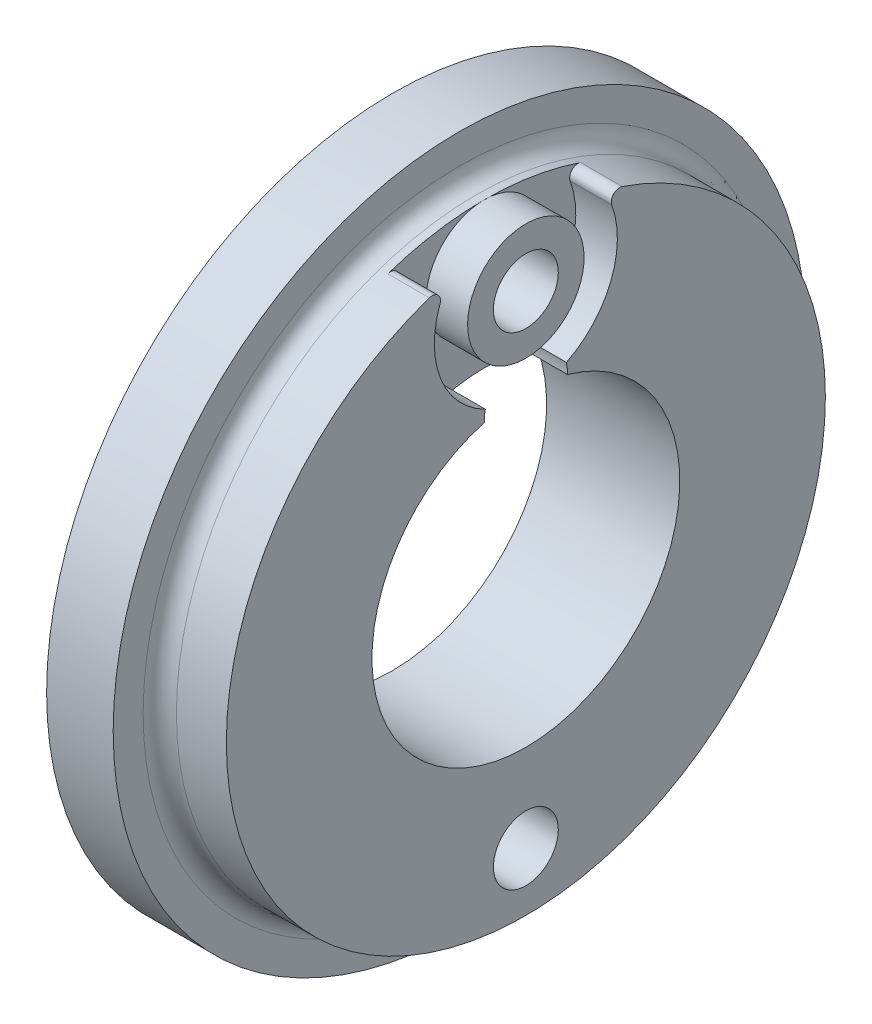
ISO-10303-21;
HEADER;
FILE_DESCRIPTION(('STEP AP214'),'2;1');
FILE_NAME('part.step','',(''),(''),'','','');
FILE_SCHEMA(('AUTOMOTIVE_DESIGN { 1 0 10303 214 1 1 1 1 }'));
ENDSEC;
DATA;
#1=APPLICATION_CONTEXT('core data for automotive mechanical design processes');
#2=APPLICATION_PROTOCOL_DEFINITION('international standard','automotive_design',2000,#1);
#3=PRODUCT_CONTEXT('',#1,'mechanical');
#4=PRODUCT('Part','Part','',(#3));
#5=PRODUCT_RELATED_PRODUCT_CATEGORY('part','',(#4));
#6=PRODUCT_DEFINITION_FORMATION('','',#4);
#7=PRODUCT_DEFINITION_CONTEXT('part definition',#1,'design');
#8=PRODUCT_DEFINITION('design','',#6,#7);
#9=PRODUCT_DEFINITION_SHAPE('','',#8);
#10=(LENGTH_UNIT() NAMED_UNIT(*) SI_UNIT(.MILLI.,.METRE.));
#11=(NAMED_UNIT(*) PLANE_ANGLE_UNIT() SI_UNIT($,.RADIAN.));
#12=(NAMED_UNIT(*) SI_UNIT($,.STERADIAN.) SOLID_ANGLE_UNIT());
#13=UNCERTAINTY_MEASURE_WITH_UNIT(LENGTH_MEASURE(1.E-05),#10,'distance_accuracy_value','');
#14=(GEOMETRIC_REPRESENTATION_CONTEXT(3) GLOBAL_UNCERTAINTY_ASSIGNED_CONTEXT((#13)) GLOBAL_UNIT_ASSIGNED_CONTEXT((#10,
#11,#12)) REPRESENTATION_CONTEXT('',''));
#15=CARTESIAN_POINT('',(0.,0.,0.));
#16=DIRECTION('',(0.,0.,1.));
#17=DIRECTION('',(1.,0.,0.));
#18=AXIS2_PLACEMENT_3D('',#15,#16,#17);
#19=CARTESIAN_POINT('',(26.2081253452331,7.96961524227068,35.));
#20=DIRECTION('',(-1.,0.,0.));
#21=DIRECTION('',(0.,1.,0.));
#22=AXIS2_PLACEMENT_3D('',#19,#20,#21);
#23=PLANE('',#22);
#24=CARTESIAN_POINT('',(26.2081253452331,15.2196152422707,35.));
#25=DIRECTION('',(1.,0.,0.));
#26=DIRECTION('',(0.,-1.,0.));
#27=AXIS2_PLACEMENT_3D('',#24,#25,#26);
#28=CIRCLE('',#27,0.975);
#29=CARTESIAN_POINT('',(26.2081253452331,16.1946152422707,35.));
#30=VERTEX_POINT('',#29);
#31=EDGE_CURVE('E327',#30,#30,#28,.T.);
#32=ORIENTED_EDGE('',*,*,#31,.F.);
#33=EDGE_LOOP('',(#32));
#34=FACE_BOUND('',#33,.T.);
#35=CARTESIAN_POINT('',(26.2081253452331,15.2196152422707,35.));
#36=DIRECTION('',(1.,0.,0.));
#37=DIRECTION('',(0.,1.,0.));
#38=AXIS2_PLACEMENT_3D('',#35,#36,#37);
#39=CIRCLE('',#38,1.75);
#40=CARTESIAN_POINT('',(26.2081253452331,13.4696152422707,35.));
#41=VERTEX_POINT('',#40);
#42=EDGE_CURVE('E308',#41,#41,#39,.T.);
#43=ORIENTED_EDGE('',*,*,#42,.T.);
#44=EDGE_LOOP('',(#43));
#45=FACE_BOUND('',#44,.T.);
#46=ADVANCED_FACE('F51',(#34,#45),#23,.F.);
#47=CARTESIAN_POINT('',(22.2081253452331,7.96961524227068,35.));
#48=DIRECTION('',(-1.,0.,0.));
#49=DIRECTION('',(0.,1.,0.));
#50=AXIS2_PLACEMENT_3D('',#47,#48,#49);
#51=PLANE('',#50);
#52=CARTESIAN_POINT('',(22.2081253452331,0.719615242270678,35.));
#53=DIRECTION('',(1.,0.,0.));
#54=DIRECTION('',(0.,-1.,0.));
#55=AXIS2_PLACEMENT_3D('',#52,#53,#54);
#56=CIRCLE('',#55,0.975);
#57=CARTESIAN_POINT('',(22.2081253452331,1.69461524227068,35.));
#58=VERTEX_POINT('',#57);
#59=EDGE_CURVE('E339',#58,#58,#56,.T.);
#60=ORIENTED_EDGE('',*,*,#59,.T.);
#61=EDGE_LOOP('',(#60));
#62=FACE_BOUND('',#61,.T.);
#63=CARTESIAN_POINT('',(22.2081253452331,15.2196152422707,35.));
#64=DIRECTION('',(1.,0.,0.));
#65=DIRECTION('',(0.,-1.,0.));
#66=AXIS2_PLACEMENT_3D('',#63,#64,#65);
#67=CIRCLE('',#66,0.975);
#68=CARTESIAN_POINT('',(22.2081253452331,16.1946152422707,35.));
#69=VERTEX_POINT('',#68);
#70=EDGE_CURVE('E332',#69,#69,#67,.T.);
#71=ORIENTED_EDGE('',*,*,#70,.T.);
#72=EDGE_LOOP('',(#71));
#73=FACE_BOUND('',#72,.T.);
#74=CARTESIAN_POINT('',(22.2081253452331,7.96961524227068,35.));
#75=DIRECTION('',(1.,0.,0.));
#76=DIRECTION('',(0.,-1.,0.));
#77=AXIS2_PLACEMENT_3D('',#74,#75,#76);
#78=CIRCLE('',#77,4.625);
#79=CARTESIAN_POINT('',(22.2081253452331,12.5946152422707,35.));
#80=VERTEX_POINT('',#79);
#81=EDGE_CURVE('E322',#80,#80,#78,.T.);
#82=ORIENTED_EDGE('',*,*,#81,.T.);
#83=EDGE_LOOP('',(#82));
#84=FACE_BOUND('',#83,.T.);
#85=CARTESIAN_POINT('',(22.2081253452331,7.96961524227068,35.));
#86=DIRECTION('',(-1.,0.,0.));
#87=DIRECTION('',(0.,-1.,0.));
#88=AXIS2_PLACEMENT_3D('',#85,#86,#87);
#89=CIRCLE('',#88,10.4);
#90=CARTESIAN_POINT('',(22.2081253452331,18.3696152422707,35.));
#91=VERTEX_POINT('',#90);
#92=EDGE_CURVE('E53',#91,#91,#89,.T.);
#93=ORIENTED_EDGE('',*,*,#92,.T.);
#94=EDGE_LOOP('',(#93));
#95=FACE_BOUND('',#94,.T.);
#96=ADVANCED_FACE('F362',(#62,#73,#84,#95),#51,.T.);
#97=CARTESIAN_POINT('',(26.2081253452331,7.96961524227068,35.));
#98=DIRECTION('',(-1.,0.,0.));
#99=DIRECTION('',(0.,-1.,0.));
#100=AXIS2_PLACEMENT_3D('',#97,#98,#99);
#101=CYLINDRICAL_SURFACE('',#100,10.4);
#102=ORIENTED_EDGE('',*,*,#92,.F.);
#103=DIRECTION('',(1.,0.,0.));
#104=VECTOR('',#103,1.);
#105=CARTESIAN_POINT('',(26.2081253452331,18.3696152422707,35.));
#106=LINE('',#105,#104);
#107=CARTESIAN_POINT('',(24.2081253452331,18.3696152422707,35.));
#108=VERTEX_POINT('',#107);
#109=EDGE_CURVE('E11',#91,#108,#106,.T.);
#110=ORIENTED_EDGE('',*,*,#109,.T.);
#111=CARTESIAN_POINT('',(24.2081253452331,7.96961524227068,35.));
#112=DIRECTION('',(-1.,0.,0.));
#113=DIRECTION('',(0.,-1.,0.));
#114=AXIS2_PLACEMENT_3D('',#111,#112,#113);
#115=CIRCLE('',#114,10.4);
#116=EDGE_CURVE('E261',#108,#108,#115,.T.);
#117=ORIENTED_EDGE('',*,*,#116,.T.);
#118=ORIENTED_EDGE('',*,*,#109,.F.);
#119=EDGE_LOOP('',(#102,#110,#117,#118));
#120=FACE_BOUND('',#119,.T.);
#121=ADVANCED_FACE('F364',(#120),#101,.T.);
#122=CARTESIAN_POINT('',(26.2081253452331,7.96961524227068,35.));
#123=DIRECTION('',(-1.,0.,0.));
#124=DIRECTION('',(0.,-1.,0.));
#125=AXIS2_PLACEMENT_3D('',#122,#123,#124);
#126=CYLINDRICAL_SURFACE('',#125,4.625);
#127=ORIENTED_EDGE('',*,*,#81,.F.);
#128=DIRECTION('',(1.,0.,0.));
#129=VECTOR('',#128,1.);
#130=CARTESIAN_POINT('',(26.2081253452331,12.5946152422707,35.));
#131=LINE('',#130,#129);
#132=CARTESIAN_POINT('',(24.9581253452331,12.5946152422707,35.));
#133=VERTEX_POINT('',#132);
#134=EDGE_CURVE('E80',#80,#133,#131,.T.);
#135=ORIENTED_EDGE('',*,*,#134,.T.);
#136=CARTESIAN_POINT('',(24.9581253452331,7.96961524227068,35.));
#137=DIRECTION('',(1.,0.,0.));
#138=DIRECTION('',(0.,-1.,0.));
#139=AXIS2_PLACEMENT_3D('',#136,#137,#138);
#140=CIRCLE('',#139,4.625);
#141=CARTESIAN_POINT('',(24.9581253452331,12.4227402422707,36.2491207845421));
#142=VERTEX_POINT('',#141);
#143=EDGE_CURVE('E219',#133,#142,#140,.T.);
#144=ORIENTED_EDGE('',*,*,#143,.T.);
#145=DIRECTION('',(1.,0.,0.));
#146=VECTOR('',#145,1.);
#147=CARTESIAN_POINT('',(26.2081253452331,12.4227402422707,36.2491207845421));
#148=LINE('',#147,#146);
#149=CARTESIAN_POINT('',(26.2081253452331,12.4227402422707,36.2491207845421));
#150=VERTEX_POINT('',#149);
#151=EDGE_CURVE('E201',#142,#150,#148,.T.);
#152=ORIENTED_EDGE('',*,*,#151,.T.);
#153=CARTESIAN_POINT('',(26.2081253452331,7.96961524227068,35.));
#154=DIRECTION('',(1.,0.,0.));
#155=DIRECTION('',(0.,-1.,0.));
#156=AXIS2_PLACEMENT_3D('',#153,#154,#155);
#157=CIRCLE('',#156,4.625);
#158=CARTESIAN_POINT('',(26.2081253452331,12.4227402422707,33.7508792154579));
#159=VERTEX_POINT('',#158);
#160=EDGE_CURVE('E200',#150,#159,#157,.T.);
#161=ORIENTED_EDGE('',*,*,#160,.T.);
#162=DIRECTION('',(-1.,0.,0.));
#163=VECTOR('',#162,1.);
#164=CARTESIAN_POINT('',(26.2081253452331,12.4227402422707,33.7508792154579));
#165=LINE('',#164,#163);
#166=CARTESIAN_POINT('',(24.9581253452331,12.4227402422707,33.7508792154579));
#167=VERTEX_POINT('',#166);
#168=EDGE_CURVE('E195',#159,#167,#165,.T.);
#169=ORIENTED_EDGE('',*,*,#168,.T.);
#170=CARTESIAN_POINT('',(24.9581253452331,7.96961524227068,35.));
#171=DIRECTION('',(1.,0.,0.));
#172=DIRECTION('',(0.,-1.,0.));
#173=AXIS2_PLACEMENT_3D('',#170,#171,#172);
#174=CIRCLE('',#173,4.625);
#175=EDGE_CURVE('E197',#167,#133,#174,.T.);
#176=ORIENTED_EDGE('',*,*,#175,.T.);
#177=ORIENTED_EDGE('',*,*,#134,.F.);
#178=EDGE_LOOP('',(#127,#135,#144,#152,#161,#169,#176,#177));
#179=FACE_BOUND('',#178,.T.);
#180=ADVANCED_FACE('F191',(#179),#126,.F.);
#181=CARTESIAN_POINT('',(26.2081253452331,15.2196152422707,35.));
#182=DIRECTION('',(-1.,0.,0.));
#183=DIRECTION('',(0.,-1.,0.));
#184=AXIS2_PLACEMENT_3D('',#181,#182,#183);
#185=CYLINDRICAL_SURFACE('',#184,0.975);
#186=ORIENTED_EDGE('',*,*,#70,.F.);
#187=DIRECTION('',(1.,0.,0.));
#188=VECTOR('',#187,1.);
#189=CARTESIAN_POINT('',(26.2081253452331,16.1946152422707,35.));
#190=LINE('',#189,#188);
#191=EDGE_CURVE('E331',#69,#30,#190,.T.);
#192=ORIENTED_EDGE('',*,*,#191,.T.);
#193=ORIENTED_EDGE('',*,*,#31,.T.);
#194=ORIENTED_EDGE('',*,*,#191,.F.);
#195=EDGE_LOOP('',(#186,#192,#193,#194));
#196=FACE_BOUND('',#195,.T.);
#197=ADVANCED_FACE('F385',(#196),#185,.F.);
#198=CARTESIAN_POINT('',(26.2081253452331,0.719615242270678,35.));
#199=DIRECTION('',(-1.,0.,0.));
#200=DIRECTION('',(0.,-1.,0.));
#201=AXIS2_PLACEMENT_3D('',#198,#199,#200);
#202=CYLINDRICAL_SURFACE('',#201,0.975);
#203=ORIENTED_EDGE('',*,*,#59,.F.);
#204=DIRECTION('',(1.,0.,0.));
#205=VECTOR('',#204,1.);
#206=CARTESIAN_POINT('',(26.2081253452331,1.69461524227068,35.));
#207=LINE('',#206,#205);
#208=CARTESIAN_POINT('',(26.2081253452331,1.69461524227068,35.));
#209=VERTEX_POINT('',#208);
#210=EDGE_CURVE('E333',#58,#209,#207,.T.);
#211=ORIENTED_EDGE('',*,*,#210,.T.);
#212=CARTESIAN_POINT('',(26.2081253452331,0.719615242270678,35.));
#213=DIRECTION('',(1.,0.,0.));
#214=DIRECTION('',(0.,-1.,0.));
#215=AXIS2_PLACEMENT_3D('',#212,#213,#214);
#216=CIRCLE('',#215,0.975);
#217=EDGE_CURVE('E318',#209,#209,#216,.T.);
#218=ORIENTED_EDGE('',*,*,#217,.T.);
#219=ORIENTED_EDGE('',*,*,#210,.F.);
#220=EDGE_LOOP('',(#203,#211,#218,#219));
#221=FACE_BOUND('',#220,.T.);
#222=ADVANCED_FACE('F372',(#221),#202,.F.);
#223=CARTESIAN_POINT('',(24.2081253452331,7.96961524227068,35.));
#224=DIRECTION('',(-1.,0.,0.));
#225=DIRECTION('',(0.,1.,0.));
#226=AXIS2_PLACEMENT_3D('',#223,#224,#225);
#227=PLANE('',#226);
#228=CARTESIAN_POINT('',(24.2081253452331,7.96961524227068,35.));
#229=DIRECTION('',(1.,0.,0.));
#230=DIRECTION('',(0.,-1.,0.));
#231=AXIS2_PLACEMENT_3D('',#228,#229,#230);
#232=CIRCLE('',#231,9.5);
#233=CARTESIAN_POINT('',(24.2081253452331,7.96961524227067,44.5));
#234=VERTEX_POINT('',#233);
#235=EDGE_CURVE('E264',#234,#234,#232,.T.);
#236=ORIENTED_EDGE('',*,*,#235,.F.);
#237=EDGE_LOOP('',(#236));
#238=FACE_BOUND('',#237,.T.);
#239=ORIENTED_EDGE('',*,*,#116,.F.);
#240=EDGE_LOOP('',(#239));
#241=FACE_BOUND('',#240,.T.);
#242=ADVANCED_FACE('F367',(#238,#241),#227,.F.);
#243=CARTESIAN_POINT('',(24.7081253452331,7.96961524227068,35.));
#244=DIRECTION('',(1.,0.,0.));
#245=DIRECTION('',(0.,0.,-1.));
#246=AXIS2_PLACEMENT_3D('',#243,#244,#245);
#247=TOROIDAL_SURFACE('',#246,9.5,0.5);
#248=ORIENTED_EDGE('',*,*,#235,.T.);
#249=CARTESIAN_POINT('',(24.7081253452331,7.96961524227068,44.5));
#250=DIRECTION('',(0.,-1.,0.));
#251=DIRECTION('',(0.,0.,1.));
#252=AXIS2_PLACEMENT_3D('',#249,#250,#251);
#253=CIRCLE('',#252,0.5);
#254=CARTESIAN_POINT('',(24.7081253452331,7.96961524227067,44.));
#255=VERTEX_POINT('',#254);
#256=EDGE_CURVE('E259',#234,#255,#253,.T.);
#257=ORIENTED_EDGE('',*,*,#256,.T.);
#258=CARTESIAN_POINT('',(24.7081253452331,7.96961524227068,35.));
#259=DIRECTION('',(-1.,0.,0.));
#260=DIRECTION('',(0.,-1.,0.));
#261=AXIS2_PLACEMENT_3D('',#258,#259,#260);
#262=CIRCLE('',#261,9.);
#263=CARTESIAN_POINT('',(24.7081253452331,16.9696152422707,35.));
#264=VERTEX_POINT('',#263);
#265=EDGE_CURVE('E236',#255,#264,#262,.T.);
#266=ORIENTED_EDGE('',*,*,#265,.T.);
#267=CARTESIAN_POINT('',(24.7081253452331,7.96961524227068,35.));
#268=DIRECTION('',(-1.,0.,0.));
#269=DIRECTION('',(0.,-1.,0.));
#270=AXIS2_PLACEMENT_3D('',#267,#268,#269);
#271=CIRCLE('',#270,9.);
#272=EDGE_CURVE('E274',#264,#255,#271,.T.);
#273=ORIENTED_EDGE('',*,*,#272,.T.);
#274=ORIENTED_EDGE('',*,*,#256,.F.);
#275=EDGE_LOOP('',(#248,#257,#266,#273,#274));
#276=FACE_BOUND('',#275,.T.);
#277=ADVANCED_FACE('F369',(#276),#247,.F.);
#278=CARTESIAN_POINT('',(26.2081253452331,15.2196152422707,35.));
#279=DIRECTION('',(-1.,0.,0.));
#280=DIRECTION('',(0.,1.,0.));
#281=AXIS2_PLACEMENT_3D('',#278,#279,#280);
#282=CYLINDRICAL_SURFACE('',#281,1.75);
#283=ORIENTED_EDGE('',*,*,#42,.F.);
#284=DIRECTION('',(-1.,0.,0.));
#285=VECTOR('',#284,1.);
#286=CARTESIAN_POINT('',(26.2081253452331,13.4696152422707,35.));
#287=LINE('',#286,#285);
#288=CARTESIAN_POINT('',(24.9581253452331,13.4696152422707,35.));
#289=VERTEX_POINT('',#288);
#290=EDGE_CURVE('E301',#41,#289,#287,.T.);
#291=ORIENTED_EDGE('',*,*,#290,.T.);
#292=CARTESIAN_POINT('',(24.9581253452331,15.2196152422707,35.));
#293=DIRECTION('',(1.,0.,0.));
#294=DIRECTION('',(0.,1.,0.));
#295=AXIS2_PLACEMENT_3D('',#292,#293,#294);
#296=CIRCLE('',#295,1.75);
#297=CARTESIAN_POINT('',(24.9581253452331,16.9696152422707,35.));
#298=VERTEX_POINT('',#297);
#299=EDGE_CURVE('E258',#289,#298,#296,.T.);
#300=ORIENTED_EDGE('',*,*,#299,.T.);
#301=CARTESIAN_POINT('',(24.9581253452331,15.2196152422707,35.));
#302=DIRECTION('',(1.,0.,0.));
#303=DIRECTION('',(0.,1.,0.));
#304=AXIS2_PLACEMENT_3D('',#301,#302,#303);
#305=CIRCLE('',#304,1.75);
#306=EDGE_CURVE('E226',#298,#289,#305,.T.);
#307=ORIENTED_EDGE('',*,*,#306,.T.);
#308=ORIENTED_EDGE('',*,*,#290,.F.);
#309=EDGE_LOOP('',(#283,#291,#300,#307,#308));
#310=FACE_BOUND('',#309,.T.);
#311=ADVANCED_FACE('F376',(#310),#282,.T.);
#312=CARTESIAN_POINT('',(26.2081253452331,12.4696152422707,35.));
#313=DIRECTION('',(-1.,0.,0.));
#314=DIRECTION('',(0.,1.,0.));
#315=AXIS2_PLACEMENT_3D('',#312,#313,#314);
#316=CYLINDRICAL_SURFACE('',#315,1.25);
#317=ORIENTED_EDGE('',*,*,#151,.F.);
#318=CARTESIAN_POINT('',(24.9581253452331,12.4696152422707,35.));
#319=DIRECTION('',(-1.,0.,0.));
#320=DIRECTION('',(0.,1.,0.));
#321=AXIS2_PLACEMENT_3D('',#318,#319,#320);
#322=CIRCLE('',#321,1.25);
#323=CARTESIAN_POINT('',(24.9581253452331,12.7537061513616,36.2172889366834));
#324=VERTEX_POINT('',#323);
#325=EDGE_CURVE('E227',#142,#324,#322,.T.);
#326=ORIENTED_EDGE('',*,*,#325,.T.);
#327=DIRECTION('',(-1.,0.,0.));
#328=VECTOR('',#327,1.);
#329=CARTESIAN_POINT('',(26.2081253452331,12.7537061513616,36.2172889366834));
#330=LINE('',#329,#328);
#331=CARTESIAN_POINT('',(26.2081253452331,12.7537061513616,36.2172889366834));
#332=VERTEX_POINT('',#331);
#333=EDGE_CURVE('E297',#332,#324,#330,.T.);
#334=ORIENTED_EDGE('',*,*,#333,.F.);
#335=CARTESIAN_POINT('',(26.2081253452331,12.4696152422707,35.));
#336=DIRECTION('',(-1.,0.,0.));
#337=DIRECTION('',(0.,1.,0.));
#338=AXIS2_PLACEMENT_3D('',#335,#336,#337);
#339=CIRCLE('',#338,1.25);
#340=EDGE_CURVE('E314',#150,#332,#339,.T.);
#341=ORIENTED_EDGE('',*,*,#340,.F.);
#342=EDGE_LOOP('',(#317,#326,#334,#341));
#343=FACE_BOUND('',#342,.T.);
#344=ADVANCED_FACE('F425',(#343),#316,.F.);
#345=CARTESIAN_POINT('',(26.2081253452331,12.4696152422707,35.));
#346=DIRECTION('',(-1.,0.,0.));
#347=DIRECTION('',(0.,1.,0.));
#348=AXIS2_PLACEMENT_3D('',#345,#346,#347);
#349=CYLINDRICAL_SURFACE('',#348,1.25);
#350=ORIENTED_EDGE('',*,*,#168,.F.);
#351=CARTESIAN_POINT('',(26.2081253452331,12.4696152422707,35.));
#352=DIRECTION('',(-1.,0.,0.));
#353=DIRECTION('',(0.,1.,0.));
#354=AXIS2_PLACEMENT_3D('',#351,#352,#353);
#355=CIRCLE('',#354,1.25);
#356=CARTESIAN_POINT('',(26.2081253452331,12.7537061513616,33.7827110633166));
#357=VERTEX_POINT('',#356);
#358=EDGE_CURVE('E307',#357,#159,#355,.T.);
#359=ORIENTED_EDGE('',*,*,#358,.F.);
#360=DIRECTION('',(-1.,0.,0.));
#361=VECTOR('',#360,1.);
#362=CARTESIAN_POINT('',(26.2081253452331,12.7537061513616,33.7827110633166));
#363=LINE('',#362,#361);
#364=CARTESIAN_POINT('',(24.9581253452331,12.7537061513616,33.7827110633166));
#365=VERTEX_POINT('',#364);
#366=EDGE_CURVE('E204',#357,#365,#363,.T.);
#367=ORIENTED_EDGE('',*,*,#366,.T.);
#368=CARTESIAN_POINT('',(24.9581253452331,12.4696152422707,35.));
#369=DIRECTION('',(-1.,0.,0.));
#370=DIRECTION('',(0.,1.,0.));
#371=AXIS2_PLACEMENT_3D('',#368,#369,#370);
#372=CIRCLE('',#371,1.25);
#373=EDGE_CURVE('E209',#365,#167,#372,.T.);
#374=ORIENTED_EDGE('',*,*,#373,.T.);
#375=EDGE_LOOP('',(#350,#359,#367,#374));
#376=FACE_BOUND('',#375,.T.);
#377=ADVANCED_FACE('F210',(#376),#349,.F.);
#378=CARTESIAN_POINT('',(26.2081253452331,15.2196152422707,35.));
#379=DIRECTION('',(-1.,0.,0.));
#380=DIRECTION('',(0.,1.,0.));
#381=AXIS2_PLACEMENT_3D('',#378,#379,#380);
#382=CYLINDRICAL_SURFACE('',#381,2.75);
#383=DIRECTION('',(-1.,0.,0.));
#384=VECTOR('',#383,1.);
#385=CARTESIAN_POINT('',(25.4581253452331,16.1678911043396,32.418668388328));
#386=LINE('',#385,#384);
#387=CARTESIAN_POINT('',(26.2081253452331,16.1678911043396,32.418668388328));
#388=VERTEX_POINT('',#387);
#389=CARTESIAN_POINT('',(24.9581253452331,16.1678911043396,32.418668388328));
#390=VERTEX_POINT('',#389);
#391=EDGE_CURVE('E325',#388,#390,#386,.T.);
#392=ORIENTED_EDGE('',*,*,#391,.T.);
#393=CARTESIAN_POINT('',(24.9581253452331,15.2196152422707,35.));
#394=DIRECTION('',(-1.,0.,0.));
#395=DIRECTION('',(0.,1.,0.));
#396=AXIS2_PLACEMENT_3D('',#393,#394,#395);
#397=CIRCLE('',#396,2.75);
#398=EDGE_CURVE('E211',#390,#365,#397,.T.);
#399=ORIENTED_EDGE('',*,*,#398,.T.);
#400=ORIENTED_EDGE('',*,*,#366,.F.);
#401=CARTESIAN_POINT('',(26.2081253452331,15.2196152422707,35.));
#402=DIRECTION('',(-1.,0.,0.));
#403=DIRECTION('',(0.,1.,0.));
#404=AXIS2_PLACEMENT_3D('',#401,#402,#403);
#405=CIRCLE('',#404,2.75);
#406=EDGE_CURVE('E302',#388,#357,#405,.T.);
#407=ORIENTED_EDGE('',*,*,#406,.F.);
#408=EDGE_LOOP('',(#392,#399,#400,#407));
#409=FACE_BOUND('',#408,.T.);
#410=ADVANCED_FACE('F429',(#409),#382,.F.);
#411=CARTESIAN_POINT('',(26.2081253452331,16.2540980008914,32.184001878176));
#412=DIRECTION('',(1.,0.,0.));
#413=DIRECTION('',(0.,0.698429405973314,0.715678953771706));
#414=AXIS2_PLACEMENT_3D('',#411,#412,#413);
#415=CYLINDRICAL_SURFACE('',#414,0.25);
#416=CARTESIAN_POINT('',(26.2081253452331,16.2540980008914,32.184001878176));
#417=DIRECTION('',(-1.,0.,0.));
#418=DIRECTION('',(0.,0.698429405973314,0.715678953771706));
#419=AXIS2_PLACEMENT_3D('',#416,#417,#418);
#420=CIRCLE('',#419,0.25);
#421=CARTESIAN_POINT('',(26.2081253452331,16.4907975082805,32.103544788981));
#422=VERTEX_POINT('',#421);
#423=EDGE_CURVE('E296',#388,#422,#420,.T.);
#424=ORIENTED_EDGE('',*,*,#423,.T.);
#425=DIRECTION('',(-1.,0.,0.));
#426=VECTOR('',#425,1.);
#427=CARTESIAN_POINT('',(25.4581253452331,16.4907975082805,32.103544788981));
#428=LINE('',#427,#426);
#429=CARTESIAN_POINT('',(24.9581253452331,16.4907975082805,32.103544788981));
#430=VERTEX_POINT('',#429);
#431=EDGE_CURVE('E278',#422,#430,#428,.T.);
#432=ORIENTED_EDGE('',*,*,#431,.T.);
#433=CARTESIAN_POINT('',(24.9581253452331,16.2540980008914,32.184001878176));
#434=DIRECTION('',(1.,0.,0.));
#435=DIRECTION('',(0.,0.698429405973314,0.715678953771706));
#436=AXIS2_PLACEMENT_3D('',#433,#434,#435);
#437=CIRCLE('',#436,0.25);
#438=EDGE_CURVE('E244',#430,#390,#437,.T.);
#439=ORIENTED_EDGE('',*,*,#438,.T.);
#440=ORIENTED_EDGE('',*,*,#391,.F.);
#441=EDGE_LOOP('',(#424,#432,#439,#440));
#442=FACE_BOUND('',#441,.T.);
#443=ADVANCED_FACE('F432',(#442),#415,.T.);
#444=CARTESIAN_POINT('',(26.2081253452331,7.96961524227068,35.));
#445=DIRECTION('',(-1.,0.,0.));
#446=DIRECTION('',(0.,1.,0.));
#447=AXIS2_PLACEMENT_3D('',#444,#445,#446);
#448=PLANE('',#447);
#449=ORIENTED_EDGE('',*,*,#217,.F.);
#450=EDGE_LOOP('',(#449));
#451=FACE_BOUND('',#450,.T.);
#452=CARTESIAN_POINT('',(26.2081253452331,16.2540980008914,37.815998121824));
#453=DIRECTION('',(-1.,0.,0.));
#454=DIRECTION('',(0.,0.698429405973314,-0.715678953771706));
#455=AXIS2_PLACEMENT_3D('',#452,#453,#454);
#456=CIRCLE('',#455,0.25);
#457=CARTESIAN_POINT('',(26.2081253452331,16.4907975082805,37.896455211019));
#458=VERTEX_POINT('',#457);
#459=CARTESIAN_POINT('',(26.2081253452331,16.1678911043396,37.581331611672));
#460=VERTEX_POINT('',#459);
#461=EDGE_CURVE('E281',#458,#460,#456,.T.);
#462=ORIENTED_EDGE('',*,*,#461,.F.);
#463=CARTESIAN_POINT('',(26.2081253452331,7.96961524227068,35.));
#464=DIRECTION('',(1.,0.,0.));
#465=DIRECTION('',(0.,-1.,0.));
#466=AXIS2_PLACEMENT_3D('',#463,#464,#465);
#467=CIRCLE('',#466,9.);
#468=EDGE_CURVE('E279',#458,#422,#467,.T.);
#469=ORIENTED_EDGE('',*,*,#468,.T.);
#470=ORIENTED_EDGE('',*,*,#423,.F.);
#471=ORIENTED_EDGE('',*,*,#406,.T.);
#472=ORIENTED_EDGE('',*,*,#358,.T.);
#473=ORIENTED_EDGE('',*,*,#160,.F.);
#474=ORIENTED_EDGE('',*,*,#340,.T.);
#475=CARTESIAN_POINT('',(26.2081253452331,15.2196152422707,35.));
#476=DIRECTION('',(-1.,0.,0.));
#477=DIRECTION('',(0.,1.,0.));
#478=AXIS2_PLACEMENT_3D('',#475,#476,#477);
#479=CIRCLE('',#478,2.75);
#480=EDGE_CURVE('E291',#332,#460,#479,.T.);
#481=ORIENTED_EDGE('',*,*,#480,.T.);
#482=EDGE_LOOP('',(#462,#469,#470,#471,#472,#473,#474,#481));
#483=FACE_BOUND('',#482,.T.);
#484=ADVANCED_FACE('F423',(#451,#483),#448,.F.);
#485=CARTESIAN_POINT('',(26.2081253452331,15.2196152422707,35.));
#486=DIRECTION('',(-1.,0.,0.));
#487=DIRECTION('',(0.,1.,0.));
#488=AXIS2_PLACEMENT_3D('',#485,#486,#487);
#489=CYLINDRICAL_SURFACE('',#488,2.75);
#490=DIRECTION('',(-1.,0.,0.));
#491=VECTOR('',#490,1.);
#492=CARTESIAN_POINT('',(26.2081253452331,16.1678911043396,37.581331611672));
#493=LINE('',#492,#491);
#494=CARTESIAN_POINT('',(24.9581253452331,16.1678911043396,37.581331611672));
#495=VERTEX_POINT('',#494);
#496=EDGE_CURVE('E288',#460,#495,#493,.T.);
#497=ORIENTED_EDGE('',*,*,#496,.F.);
#498=ORIENTED_EDGE('',*,*,#480,.F.);
#499=ORIENTED_EDGE('',*,*,#333,.T.);
#500=CARTESIAN_POINT('',(24.9581253452331,15.2196152422707,35.));
#501=DIRECTION('',(-1.,0.,0.));
#502=DIRECTION('',(0.,1.,0.));
#503=AXIS2_PLACEMENT_3D('',#500,#501,#502);
#504=CIRCLE('',#503,2.75);
#505=EDGE_CURVE('E233',#324,#495,#504,.T.);
#506=ORIENTED_EDGE('',*,*,#505,.T.);
#507=EDGE_LOOP('',(#497,#498,#499,#506));
#508=FACE_BOUND('',#507,.T.);
#509=ADVANCED_FACE('F416',(#508),#489,.F.);
#510=CARTESIAN_POINT('',(26.2081253452331,16.2540980008914,37.815998121824));
#511=DIRECTION('',(-1.,0.,0.));
#512=DIRECTION('',(0.,0.698429405973314,-0.715678953771706));
#513=AXIS2_PLACEMENT_3D('',#510,#511,#512);
#514=CYLINDRICAL_SURFACE('',#513,0.25);
#515=ORIENTED_EDGE('',*,*,#461,.T.);
#516=ORIENTED_EDGE('',*,*,#496,.T.);
#517=CARTESIAN_POINT('',(24.9581253452331,16.2540980008914,37.815998121824));
#518=DIRECTION('',(1.,0.,0.));
#519=DIRECTION('',(0.,0.698429405973314,-0.715678953771706));
#520=AXIS2_PLACEMENT_3D('',#517,#518,#519);
#521=CIRCLE('',#520,0.25);
#522=CARTESIAN_POINT('',(24.9581253452331,16.4907975082805,37.896455211019));
#523=VERTEX_POINT('',#522);
#524=EDGE_CURVE('E254',#495,#523,#521,.T.);
#525=ORIENTED_EDGE('',*,*,#524,.T.);
#526=DIRECTION('',(-1.,0.,0.));
#527=VECTOR('',#526,1.);
#528=CARTESIAN_POINT('',(25.4581253452331,16.4907975082805,37.896455211019));
#529=LINE('',#528,#527);
#530=EDGE_CURVE('E228',#458,#523,#529,.T.);
#531=ORIENTED_EDGE('',*,*,#530,.F.);
#532=EDGE_LOOP('',(#515,#516,#525,#531));
#533=FACE_BOUND('',#532,.T.);
#534=ADVANCED_FACE('F414',(#533),#514,.T.);
#535=CARTESIAN_POINT('',(26.2081253452331,7.96961524227068,35.));
#536=DIRECTION('',(-1.,0.,0.));
#537=DIRECTION('',(0.,-1.,0.));
#538=AXIS2_PLACEMENT_3D('',#535,#536,#537);
#539=CYLINDRICAL_SURFACE('',#538,9.);
#540=ORIENTED_EDGE('',*,*,#530,.T.);
#541=CARTESIAN_POINT('',(24.9581253452331,7.96961524227068,35.));
#542=DIRECTION('',(-1.,0.,0.));
#543=DIRECTION('',(0.,-1.,0.));
#544=AXIS2_PLACEMENT_3D('',#541,#542,#543);
#545=CIRCLE('',#544,9.);
#546=EDGE_CURVE('E262',#523,#298,#545,.T.);
#547=ORIENTED_EDGE('',*,*,#546,.T.);
#548=DIRECTION('',(-1.,0.,0.));
#549=VECTOR('',#548,1.);
#550=CARTESIAN_POINT('',(26.2081253452331,16.9696152422707,35.));
#551=LINE('',#550,#549);
#552=EDGE_CURVE('E234',#298,#264,#551,.T.);
#553=ORIENTED_EDGE('',*,*,#552,.T.);
#554=ORIENTED_EDGE('',*,*,#265,.F.);
#555=ORIENTED_EDGE('',*,*,#272,.F.);
#556=ORIENTED_EDGE('',*,*,#552,.F.);
#557=CARTESIAN_POINT('',(24.9581253452331,7.96961524227068,35.));
#558=DIRECTION('',(-1.,0.,0.));
#559=DIRECTION('',(0.,-1.,0.));
#560=AXIS2_PLACEMENT_3D('',#557,#558,#559);
#561=CIRCLE('',#560,9.);
#562=EDGE_CURVE('E246',#298,#430,#561,.T.);
#563=ORIENTED_EDGE('',*,*,#562,.T.);
#564=ORIENTED_EDGE('',*,*,#431,.F.);
#565=ORIENTED_EDGE('',*,*,#468,.F.);
#566=EDGE_LOOP('',(#540,#547,#553,#554,#555,#556,#563,#564,#565));
#567=FACE_BOUND('',#566,.T.);
#568=ADVANCED_FACE('F408',(#567),#539,.T.);
#569=CARTESIAN_POINT('',(24.9581253452331,14.0946152422707,35.));
#570=DIRECTION('',(1.,0.,0.));
#571=DIRECTION('',(0.,1.,0.));
#572=AXIS2_PLACEMENT_3D('',#569,#570,#571);
#573=PLANE('',#572);
#574=ORIENTED_EDGE('',*,*,#175,.F.);
#575=ORIENTED_EDGE('',*,*,#373,.F.);
#576=ORIENTED_EDGE('',*,*,#398,.F.);
#577=ORIENTED_EDGE('',*,*,#438,.F.);
#578=ORIENTED_EDGE('',*,*,#562,.F.);
#579=ORIENTED_EDGE('',*,*,#299,.F.);
#580=ORIENTED_EDGE('',*,*,#306,.F.);
#581=ORIENTED_EDGE('',*,*,#546,.F.);
#582=ORIENTED_EDGE('',*,*,#524,.F.);
#583=ORIENTED_EDGE('',*,*,#505,.F.);
#584=ORIENTED_EDGE('',*,*,#325,.F.);
#585=ORIENTED_EDGE('',*,*,#143,.F.);
#586=EDGE_LOOP('',(#574,#575,#576,#577,#578,#579,#580,#581,#582,#583,#584,#585));
#587=FACE_BOUND('',#586,.T.);
#588=ADVANCED_FACE('F218',(#587),#573,.T.);
#589=CLOSED_SHELL('',(#46,#96,#121,#180,#197,#222,#242,#277,#311,#344,#377,#410,#443,#484,#509,
#534,#568,#588));
#590=MANIFOLD_SOLID_BREP('B2',#589);
#591=ADVANCED_BREP_SHAPE_REPRESENTATION('',(#18,#590),#14);
#592=SHAPE_DEFINITION_REPRESENTATION(#9,#591);
ENDSEC;
END-ISO-10303-21;
